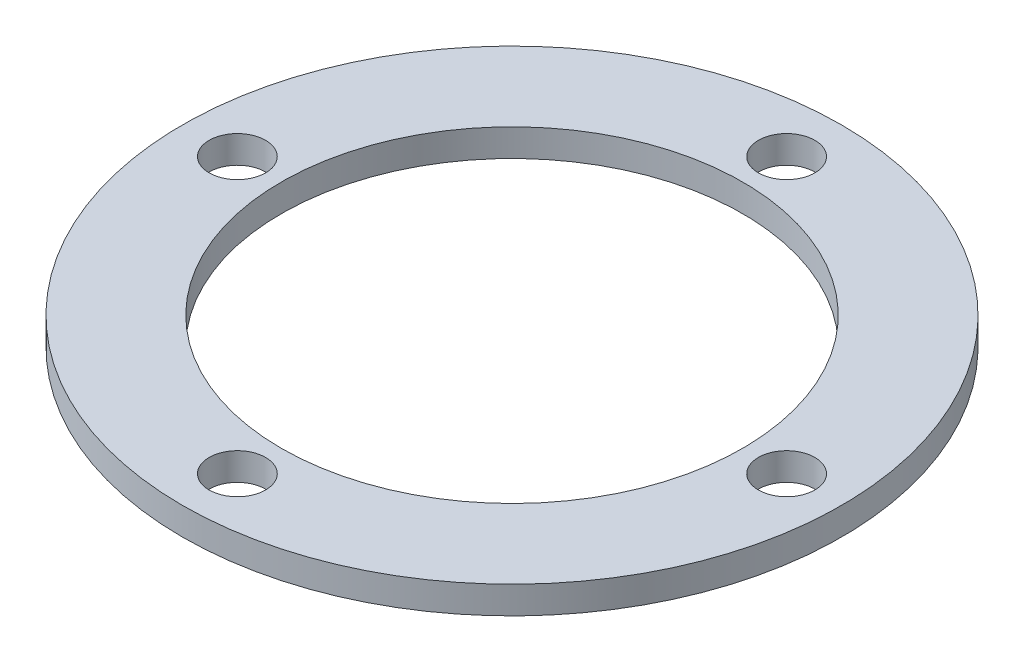
ISO-10303-21;
HEADER;
FILE_DESCRIPTION(('STEP AP214'),'2;1');
FILE_NAME('part.step','',(''),(''),'','','');
FILE_SCHEMA(('AUTOMOTIVE_DESIGN { 1 0 10303 214 1 1 1 1 }'));
ENDSEC;
DATA;
#1=APPLICATION_CONTEXT('core data for automotive mechanical design processes');
#2=APPLICATION_PROTOCOL_DEFINITION('international standard','automotive_design',2000,#1);
#3=PRODUCT_CONTEXT('',#1,'mechanical');
#4=PRODUCT('Part','Part','',(#3));
#5=PRODUCT_RELATED_PRODUCT_CATEGORY('part','',(#4));
#6=PRODUCT_DEFINITION_FORMATION('','',#4);
#7=PRODUCT_DEFINITION_CONTEXT('part definition',#1,'design');
#8=PRODUCT_DEFINITION('design','',#6,#7);
#9=PRODUCT_DEFINITION_SHAPE('','',#8);
#10=(LENGTH_UNIT() NAMED_UNIT(*) SI_UNIT(.MILLI.,.METRE.));
#11=(NAMED_UNIT(*) PLANE_ANGLE_UNIT() SI_UNIT($,.RADIAN.));
#12=(NAMED_UNIT(*) SI_UNIT($,.STERADIAN.) SOLID_ANGLE_UNIT());
#13=UNCERTAINTY_MEASURE_WITH_UNIT(LENGTH_MEASURE(1.E-05),#10,'distance_accuracy_value','');
#14=(GEOMETRIC_REPRESENTATION_CONTEXT(3) GLOBAL_UNCERTAINTY_ASSIGNED_CONTEXT((#13)) GLOBAL_UNIT_ASSIGNED_CONTEXT((#10,
#11,#12)) REPRESENTATION_CONTEXT('',''));
#15=CARTESIAN_POINT('',(0.,0.,0.));
#16=DIRECTION('',(0.,0.,1.));
#17=DIRECTION('',(1.,0.,0.));
#18=AXIS2_PLACEMENT_3D('',#15,#16,#17);
#19=CARTESIAN_POINT('',(0.,3.175,0.));
#20=DIRECTION('',(0.,1.,0.));
#21=DIRECTION('',(0.,0.,1.));
#22=AXIS2_PLACEMENT_3D('',#19,#20,#21);
#23=PLANE('',#22);
#24=CARTESIAN_POINT('',(0.,3.175,31.75));
#25=DIRECTION('',(0.,1.,0.));
#26=DIRECTION('',(0.,0.,1.));
#27=AXIS2_PLACEMENT_3D('',#24,#25,#26);
#28=CIRCLE('',#27,3.26390000000022);
#29=CARTESIAN_POINT('',(0.,3.175,35.0139000000002));
#30=VERTEX_POINT('',#29);
#31=EDGE_CURVE('E59',#30,#30,#28,.T.);
#32=ORIENTED_EDGE('',*,*,#31,.F.);
#33=EDGE_LOOP('',(#32));
#34=FACE_BOUND('',#33,.T.);
#35=CARTESIAN_POINT('',(0.,3.175,-31.75));
#36=DIRECTION('',(0.,1.,0.));
#37=DIRECTION('',(0.,0.,1.));
#38=AXIS2_PLACEMENT_3D('',#35,#36,#37);
#39=CIRCLE('',#38,3.2639);
#40=CARTESIAN_POINT('',(0.,3.175,-28.4861));
#41=VERTEX_POINT('',#40);
#42=EDGE_CURVE('E47',#41,#41,#39,.T.);
#43=ORIENTED_EDGE('',*,*,#42,.F.);
#44=EDGE_LOOP('',(#43));
#45=FACE_BOUND('',#44,.T.);
#46=CARTESIAN_POINT('',(0.,3.175,0.));
#47=DIRECTION('',(0.,1.,0.));
#48=DIRECTION('',(0.,0.,1.));
#49=AXIS2_PLACEMENT_3D('',#46,#47,#48);
#50=CIRCLE('',#49,38.1);
#51=CARTESIAN_POINT('',(0.,3.175,38.1));
#52=VERTEX_POINT('',#51);
#53=EDGE_CURVE('E10',#52,#52,#50,.T.);
#54=ORIENTED_EDGE('',*,*,#53,.T.);
#55=EDGE_LOOP('',(#54));
#56=FACE_BOUND('',#55,.T.);
#57=CARTESIAN_POINT('',(0.,3.175,0.));
#58=DIRECTION('',(0.,1.,0.));
#59=DIRECTION('',(0.,0.,1.));
#60=AXIS2_PLACEMENT_3D('',#57,#58,#59);
#61=CIRCLE('',#60,26.67);
#62=CARTESIAN_POINT('',(0.,3.175,26.67));
#63=VERTEX_POINT('',#62);
#64=EDGE_CURVE('E42',#63,#63,#61,.T.);
#65=ORIENTED_EDGE('',*,*,#64,.F.);
#66=EDGE_LOOP('',(#65));
#67=FACE_BOUND('',#66,.T.);
#68=CARTESIAN_POINT('',(31.75,3.175,0.));
#69=DIRECTION('',(0.,1.,0.));
#70=DIRECTION('',(0.,0.,1.));
#71=AXIS2_PLACEMENT_3D('',#68,#69,#70);
#72=CIRCLE('',#71,3.26390000000011);
#73=CARTESIAN_POINT('',(31.75,3.175,3.26390000000011));
#74=VERTEX_POINT('',#73);
#75=EDGE_CURVE('E53',#74,#74,#72,.T.);
#76=ORIENTED_EDGE('',*,*,#75,.F.);
#77=EDGE_LOOP('',(#76));
#78=FACE_BOUND('',#77,.T.);
#79=CARTESIAN_POINT('',(-31.75,3.175,0.));
#80=DIRECTION('',(0.,1.,0.));
#81=DIRECTION('',(0.,0.,1.));
#82=AXIS2_PLACEMENT_3D('',#79,#80,#81);
#83=CIRCLE('',#82,3.26390000000033);
#84=CARTESIAN_POINT('',(-31.75,3.175,3.26390000000033));
#85=VERTEX_POINT('',#84);
#86=EDGE_CURVE('E65',#85,#85,#83,.T.);
#87=ORIENTED_EDGE('',*,*,#86,.F.);
#88=EDGE_LOOP('',(#87));
#89=FACE_BOUND('',#88,.T.);
#90=ADVANCED_FACE('F31',(#34,#45,#56,#67,#78,#89),#23,.T.);
#91=CARTESIAN_POINT('',(0.,0.,0.));
#92=DIRECTION('',(0.,1.,0.));
#93=DIRECTION('',(0.,0.,1.));
#94=AXIS2_PLACEMENT_3D('',#91,#92,#93);
#95=PLANE('',#94);
#96=CARTESIAN_POINT('',(0.,0.,0.));
#97=DIRECTION('',(0.,1.,0.));
#98=DIRECTION('',(0.,0.,1.));
#99=AXIS2_PLACEMENT_3D('',#96,#97,#98);
#100=CIRCLE('',#99,38.1);
#101=CARTESIAN_POINT('',(0.,0.,38.1));
#102=VERTEX_POINT('',#101);
#103=EDGE_CURVE('E35',#102,#102,#100,.T.);
#104=ORIENTED_EDGE('',*,*,#103,.F.);
#105=EDGE_LOOP('',(#104));
#106=FACE_BOUND('',#105,.T.);
#107=CARTESIAN_POINT('',(0.,0.,0.));
#108=DIRECTION('',(0.,1.,0.));
#109=DIRECTION('',(0.,0.,1.));
#110=AXIS2_PLACEMENT_3D('',#107,#108,#109);
#111=CIRCLE('',#110,26.67);
#112=CARTESIAN_POINT('',(0.,0.,26.67));
#113=VERTEX_POINT('',#112);
#114=EDGE_CURVE('E44',#113,#113,#111,.T.);
#115=ORIENTED_EDGE('',*,*,#114,.T.);
#116=EDGE_LOOP('',(#115));
#117=FACE_BOUND('',#116,.T.);
#118=CARTESIAN_POINT('',(0.,0.,-31.75));
#119=DIRECTION('',(0.,1.,0.));
#120=DIRECTION('',(0.,0.,1.));
#121=AXIS2_PLACEMENT_3D('',#118,#119,#120);
#122=CIRCLE('',#121,3.2639);
#123=CARTESIAN_POINT('',(0.,0.,-28.4861));
#124=VERTEX_POINT('',#123);
#125=EDGE_CURVE('E50',#124,#124,#122,.T.);
#126=ORIENTED_EDGE('',*,*,#125,.T.);
#127=EDGE_LOOP('',(#126));
#128=FACE_BOUND('',#127,.T.);
#129=CARTESIAN_POINT('',(31.75,0.,0.));
#130=DIRECTION('',(0.,1.,0.));
#131=DIRECTION('',(0.,0.,1.));
#132=AXIS2_PLACEMENT_3D('',#129,#130,#131);
#133=CIRCLE('',#132,3.26390000000011);
#134=CARTESIAN_POINT('',(31.75,0.,3.26390000000011));
#135=VERTEX_POINT('',#134);
#136=EDGE_CURVE('E56',#135,#135,#133,.T.);
#137=ORIENTED_EDGE('',*,*,#136,.T.);
#138=EDGE_LOOP('',(#137));
#139=FACE_BOUND('',#138,.T.);
#140=CARTESIAN_POINT('',(0.,0.,31.75));
#141=DIRECTION('',(0.,1.,0.));
#142=DIRECTION('',(0.,0.,1.));
#143=AXIS2_PLACEMENT_3D('',#140,#141,#142);
#144=CIRCLE('',#143,3.26390000000022);
#145=CARTESIAN_POINT('',(0.,0.,35.0139000000002));
#146=VERTEX_POINT('',#145);
#147=EDGE_CURVE('E62',#146,#146,#144,.T.);
#148=ORIENTED_EDGE('',*,*,#147,.T.);
#149=EDGE_LOOP('',(#148));
#150=FACE_BOUND('',#149,.T.);
#151=CARTESIAN_POINT('',(-31.75,0.,0.));
#152=DIRECTION('',(0.,1.,0.));
#153=DIRECTION('',(0.,0.,1.));
#154=AXIS2_PLACEMENT_3D('',#151,#152,#153);
#155=CIRCLE('',#154,3.26390000000033);
#156=CARTESIAN_POINT('',(-31.75,0.,3.26390000000033));
#157=VERTEX_POINT('',#156);
#158=EDGE_CURVE('E68',#157,#157,#155,.T.);
#159=ORIENTED_EDGE('',*,*,#158,.T.);
#160=EDGE_LOOP('',(#159));
#161=FACE_BOUND('',#160,.T.);
#162=ADVANCED_FACE('F78',(#106,#117,#128,#139,#150,#161),#95,.F.);
#163=CARTESIAN_POINT('',(0.,3.175,0.));
#164=DIRECTION('',(0.,-1.,0.));
#165=DIRECTION('',(0.,0.,-1.));
#166=AXIS2_PLACEMENT_3D('',#163,#164,#165);
#167=CYLINDRICAL_SURFACE('',#166,38.1);
#168=ORIENTED_EDGE('',*,*,#53,.F.);
#169=EDGE_LOOP('',(#168));
#170=FACE_BOUND('',#169,.T.);
#171=ORIENTED_EDGE('',*,*,#103,.T.);
#172=EDGE_LOOP('',(#171));
#173=FACE_BOUND('',#172,.T.);
#174=ADVANCED_FACE('F33',(#170,#173),#167,.T.);
#175=CARTESIAN_POINT('',(0.,3.175,0.));
#176=DIRECTION('',(0.,-1.,0.));
#177=DIRECTION('',(0.,0.,-1.));
#178=AXIS2_PLACEMENT_3D('',#175,#176,#177);
#179=CYLINDRICAL_SURFACE('',#178,26.67);
#180=ORIENTED_EDGE('',*,*,#64,.T.);
#181=EDGE_LOOP('',(#180));
#182=FACE_BOUND('',#181,.T.);
#183=ORIENTED_EDGE('',*,*,#114,.F.);
#184=EDGE_LOOP('',(#183));
#185=FACE_BOUND('',#184,.T.);
#186=ADVANCED_FACE('F88',(#182,#185),#179,.F.);
#187=CARTESIAN_POINT('',(0.,3.175,-31.75));
#188=DIRECTION('',(0.,-1.,0.));
#189=DIRECTION('',(0.,0.,-1.));
#190=AXIS2_PLACEMENT_3D('',#187,#188,#189);
#191=CYLINDRICAL_SURFACE('',#190,3.2639);
#192=ORIENTED_EDGE('',*,*,#42,.T.);
#193=EDGE_LOOP('',(#192));
#194=FACE_BOUND('',#193,.T.);
#195=ORIENTED_EDGE('',*,*,#125,.F.);
#196=EDGE_LOOP('',(#195));
#197=FACE_BOUND('',#196,.T.);
#198=ADVANCED_FACE('F91',(#194,#197),#191,.F.);
#199=CARTESIAN_POINT('',(31.75,3.175,0.));
#200=DIRECTION('',(0.,-1.,0.));
#201=DIRECTION('',(0.,0.,-1.));
#202=AXIS2_PLACEMENT_3D('',#199,#200,#201);
#203=CYLINDRICAL_SURFACE('',#202,3.26390000000011);
#204=ORIENTED_EDGE('',*,*,#75,.T.);
#205=EDGE_LOOP('',(#204));
#206=FACE_BOUND('',#205,.T.);
#207=ORIENTED_EDGE('',*,*,#136,.F.);
#208=EDGE_LOOP('',(#207));
#209=FACE_BOUND('',#208,.T.);
#210=ADVANCED_FACE('F95',(#206,#209),#203,.F.);
#211=CARTESIAN_POINT('',(0.,3.175,31.75));
#212=DIRECTION('',(0.,-1.,0.));
#213=DIRECTION('',(0.,0.,-1.));
#214=AXIS2_PLACEMENT_3D('',#211,#212,#213);
#215=CYLINDRICAL_SURFACE('',#214,3.26390000000022);
#216=ORIENTED_EDGE('',*,*,#31,.T.);
#217=EDGE_LOOP('',(#216));
#218=FACE_BOUND('',#217,.T.);
#219=ORIENTED_EDGE('',*,*,#147,.F.);
#220=EDGE_LOOP('',(#219));
#221=FACE_BOUND('',#220,.T.);
#222=ADVANCED_FACE('F99',(#218,#221),#215,.F.);
#223=CARTESIAN_POINT('',(-31.75,3.175,0.));
#224=DIRECTION('',(0.,-1.,0.));
#225=DIRECTION('',(0.,0.,-1.));
#226=AXIS2_PLACEMENT_3D('',#223,#224,#225);
#227=CYLINDRICAL_SURFACE('',#226,3.26390000000033);
#228=ORIENTED_EDGE('',*,*,#86,.T.);
#229=EDGE_LOOP('',(#228));
#230=FACE_BOUND('',#229,.T.);
#231=ORIENTED_EDGE('',*,*,#158,.F.);
#232=EDGE_LOOP('',(#231));
#233=FACE_BOUND('',#232,.T.);
#234=ADVANCED_FACE('F74',(#230,#233),#227,.F.);
#235=CLOSED_SHELL('',(#90,#162,#174,#186,#198,#210,#222,#234));
#236=MANIFOLD_SOLID_BREP('B2',#235);
#237=ADVANCED_BREP_SHAPE_REPRESENTATION('',(#18,#236),#14);
#238=SHAPE_DEFINITION_REPRESENTATION(#9,#237);
ENDSEC;
END-ISO-10303-21;
